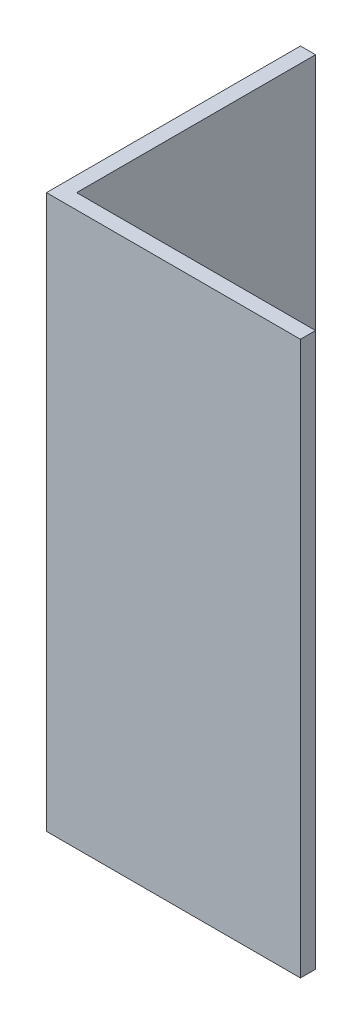
ISO-10303-21;
HEADER;
FILE_DESCRIPTION(('STEP AP214'),'2;1');
FILE_NAME('part.step','',(''),(''),'','','');
FILE_SCHEMA(('AUTOMOTIVE_DESIGN { 1 0 10303 214 1 1 1 1 }'));
ENDSEC;
DATA;
#1=APPLICATION_CONTEXT('core data for automotive mechanical design processes');
#2=APPLICATION_PROTOCOL_DEFINITION('international standard','automotive_design',2000,#1);
#3=PRODUCT_CONTEXT('',#1,'mechanical');
#4=PRODUCT('Part','Part','',(#3));
#5=PRODUCT_RELATED_PRODUCT_CATEGORY('part','',(#4));
#6=PRODUCT_DEFINITION_FORMATION('','',#4);
#7=PRODUCT_DEFINITION_CONTEXT('part definition',#1,'design');
#8=PRODUCT_DEFINITION('design','',#6,#7);
#9=PRODUCT_DEFINITION_SHAPE('','',#8);
#10=(LENGTH_UNIT() NAMED_UNIT(*) SI_UNIT(.MILLI.,.METRE.));
#11=(NAMED_UNIT(*) PLANE_ANGLE_UNIT() SI_UNIT($,.RADIAN.));
#12=(NAMED_UNIT(*) SI_UNIT($,.STERADIAN.) SOLID_ANGLE_UNIT());
#13=UNCERTAINTY_MEASURE_WITH_UNIT(LENGTH_MEASURE(1.E-05),#10,'distance_accuracy_value','');
#14=(GEOMETRIC_REPRESENTATION_CONTEXT(3) GLOBAL_UNCERTAINTY_ASSIGNED_CONTEXT((#13)) GLOBAL_UNIT_ASSIGNED_CONTEXT((#10,
#11,#12)) REPRESENTATION_CONTEXT('',''));
#15=CARTESIAN_POINT('',(0.,0.,0.));
#16=DIRECTION('',(0.,0.,1.));
#17=DIRECTION('',(1.,0.,0.));
#18=AXIS2_PLACEMENT_3D('',#15,#16,#17);
#19=CARTESIAN_POINT('',(-3.00000000000003,110.,-47.5));
#20=DIRECTION('',(0.,0.,1.));
#21=DIRECTION('',(1.,0.,0.));
#22=AXIS2_PLACEMENT_3D('',#19,#20,#21);
#23=PLANE('',#22);
#24=DIRECTION('',(-1.,0.,0.));
#25=VECTOR('',#24,1.);
#26=CARTESIAN_POINT('',(-3.00000000000003,0.,-47.5));
#27=LINE('',#26,#25);
#28=CARTESIAN_POINT('',(0.,0.,-47.5));
#29=VERTEX_POINT('',#28);
#30=CARTESIAN_POINT('',(-3.00000000000003,0.,-47.5));
#31=VERTEX_POINT('',#30);
#32=EDGE_CURVE('E141',#29,#31,#27,.T.);
#33=ORIENTED_EDGE('',*,*,#32,.T.);
#34=DIRECTION('',(0.,-1.,0.));
#35=VECTOR('',#34,1.);
#36=CARTESIAN_POINT('',(-3.00000000000003,110.,-47.5));
#37=LINE('',#36,#35);
#38=CARTESIAN_POINT('',(-3.00000000000003,110.,-47.5));
#39=VERTEX_POINT('',#38);
#40=EDGE_CURVE('E11',#39,#31,#37,.T.);
#41=ORIENTED_EDGE('',*,*,#40,.F.);
#42=DIRECTION('',(-1.,0.,0.));
#43=VECTOR('',#42,1.);
#44=CARTESIAN_POINT('',(-3.00000000000003,110.,-47.5));
#45=LINE('',#44,#43);
#46=CARTESIAN_POINT('',(0.,110.,-47.5));
#47=VERTEX_POINT('',#46);
#48=EDGE_CURVE('E156',#47,#39,#45,.T.);
#49=ORIENTED_EDGE('',*,*,#48,.F.);
#50=DIRECTION('',(0.,-1.,0.));
#51=VECTOR('',#50,1.);
#52=CARTESIAN_POINT('',(0.,110.,-47.5));
#53=LINE('',#52,#51);
#54=EDGE_CURVE('E137',#47,#29,#53,.T.);
#55=ORIENTED_EDGE('',*,*,#54,.T.);
#56=EDGE_LOOP('',(#33,#41,#49,#55));
#57=FACE_BOUND('',#56,.T.);
#58=ADVANCED_FACE('F41',(#57),#23,.F.);
#59=CARTESIAN_POINT('',(-3.00000000000001,110.,3.00000000000001));
#60=DIRECTION('',(1.,0.,0.));
#61=DIRECTION('',(0.,0.,-1.));
#62=AXIS2_PLACEMENT_3D('',#59,#60,#61);
#63=PLANE('',#62);
#64=DIRECTION('',(0.,0.,1.));
#65=VECTOR('',#64,1.);
#66=CARTESIAN_POINT('',(-3.00000000000001,0.,3.00000000000001));
#67=LINE('',#66,#65);
#68=CARTESIAN_POINT('',(-3.00000000000001,0.,3.00000000000001));
#69=VERTEX_POINT('',#68);
#70=EDGE_CURVE('E145',#31,#69,#67,.T.);
#71=ORIENTED_EDGE('',*,*,#70,.T.);
#72=DIRECTION('',(0.,-1.,0.));
#73=VECTOR('',#72,1.);
#74=CARTESIAN_POINT('',(-3.00000000000001,110.,3.00000000000001));
#75=LINE('',#74,#73);
#76=CARTESIAN_POINT('',(-3.00000000000001,110.,3.00000000000001));
#77=VERTEX_POINT('',#76);
#78=EDGE_CURVE('E50',#77,#69,#75,.T.);
#79=ORIENTED_EDGE('',*,*,#78,.F.);
#80=DIRECTION('',(0.,0.,1.));
#81=VECTOR('',#80,1.);
#82=CARTESIAN_POINT('',(-3.00000000000001,110.,3.00000000000001));
#83=LINE('',#82,#81);
#84=EDGE_CURVE('E103',#39,#77,#83,.T.);
#85=ORIENTED_EDGE('',*,*,#84,.F.);
#86=ORIENTED_EDGE('',*,*,#40,.T.);
#87=EDGE_LOOP('',(#71,#79,#85,#86));
#88=FACE_BOUND('',#87,.T.);
#89=ADVANCED_FACE('F184',(#88),#63,.F.);
#90=CARTESIAN_POINT('',(47.5,110.,3.));
#91=DIRECTION('',(0.,0.,-1.));
#92=DIRECTION('',(-1.,0.,0.));
#93=AXIS2_PLACEMENT_3D('',#90,#91,#92);
#94=PLANE('',#93);
#95=DIRECTION('',(1.,0.,0.));
#96=VECTOR('',#95,1.);
#97=CARTESIAN_POINT('',(47.5,0.,3.));
#98=LINE('',#97,#96);
#99=CARTESIAN_POINT('',(47.5,0.,3.));
#100=VERTEX_POINT('',#99);
#101=EDGE_CURVE('E148',#69,#100,#98,.T.);
#102=ORIENTED_EDGE('',*,*,#101,.T.);
#103=DIRECTION('',(0.,-1.,0.));
#104=VECTOR('',#103,1.);
#105=CARTESIAN_POINT('',(47.5,110.,3.));
#106=LINE('',#105,#104);
#107=CARTESIAN_POINT('',(47.5,110.,3.));
#108=VERTEX_POINT('',#107);
#109=EDGE_CURVE('E129',#108,#100,#106,.T.);
#110=ORIENTED_EDGE('',*,*,#109,.F.);
#111=DIRECTION('',(1.,0.,0.));
#112=VECTOR('',#111,1.);
#113=CARTESIAN_POINT('',(47.5,110.,3.));
#114=LINE('',#113,#112);
#115=EDGE_CURVE('E118',#77,#108,#114,.T.);
#116=ORIENTED_EDGE('',*,*,#115,.F.);
#117=ORIENTED_EDGE('',*,*,#78,.T.);
#118=EDGE_LOOP('',(#102,#110,#116,#117));
#119=FACE_BOUND('',#118,.T.);
#120=ADVANCED_FACE('F166',(#119),#94,.F.);
#121=CARTESIAN_POINT('',(47.5,110.,0.));
#122=DIRECTION('',(-1.,0.,0.));
#123=DIRECTION('',(0.,0.,1.));
#124=AXIS2_PLACEMENT_3D('',#121,#122,#123);
#125=PLANE('',#124);
#126=DIRECTION('',(0.,0.,-1.));
#127=VECTOR('',#126,1.);
#128=CARTESIAN_POINT('',(47.5,0.,0.));
#129=LINE('',#128,#127);
#130=CARTESIAN_POINT('',(47.5,0.,0.));
#131=VERTEX_POINT('',#130);
#132=EDGE_CURVE('E127',#100,#131,#129,.T.);
#133=ORIENTED_EDGE('',*,*,#132,.T.);
#134=DIRECTION('',(0.,-1.,0.));
#135=VECTOR('',#134,1.);
#136=CARTESIAN_POINT('',(47.5,110.,0.));
#137=LINE('',#136,#135);
#138=CARTESIAN_POINT('',(47.5,110.,0.));
#139=VERTEX_POINT('',#138);
#140=EDGE_CURVE('E124',#139,#131,#137,.T.);
#141=ORIENTED_EDGE('',*,*,#140,.F.);
#142=DIRECTION('',(0.,0.,-1.));
#143=VECTOR('',#142,1.);
#144=CARTESIAN_POINT('',(47.5,110.,0.));
#145=LINE('',#144,#143);
#146=EDGE_CURVE('E112',#108,#139,#145,.T.);
#147=ORIENTED_EDGE('',*,*,#146,.F.);
#148=ORIENTED_EDGE('',*,*,#109,.T.);
#149=EDGE_LOOP('',(#133,#141,#147,#148));
#150=FACE_BOUND('',#149,.T.);
#151=ADVANCED_FACE('F125',(#150),#125,.F.);
#152=CARTESIAN_POINT('',(0.,110.,0.));
#153=DIRECTION('',(0.,0.,1.));
#154=DIRECTION('',(1.,0.,0.));
#155=AXIS2_PLACEMENT_3D('',#152,#153,#154);
#156=PLANE('',#155);
#157=DIRECTION('',(-1.,0.,0.));
#158=VECTOR('',#157,1.);
#159=CARTESIAN_POINT('',(0.,0.,0.));
#160=LINE('',#159,#158);
#161=CARTESIAN_POINT('',(0.,0.,0.));
#162=VERTEX_POINT('',#161);
#163=EDGE_CURVE('E88',#131,#162,#160,.T.);
#164=ORIENTED_EDGE('',*,*,#163,.T.);
#165=DIRECTION('',(0.,-1.,0.));
#166=VECTOR('',#165,1.);
#167=CARTESIAN_POINT('',(0.,110.,0.));
#168=LINE('',#167,#166);
#169=CARTESIAN_POINT('',(0.,110.,0.));
#170=VERTEX_POINT('',#169);
#171=EDGE_CURVE('E130',#170,#162,#168,.T.);
#172=ORIENTED_EDGE('',*,*,#171,.F.);
#173=DIRECTION('',(-1.,0.,0.));
#174=VECTOR('',#173,1.);
#175=CARTESIAN_POINT('',(0.,110.,0.));
#176=LINE('',#175,#174);
#177=EDGE_CURVE('E116',#139,#170,#176,.T.);
#178=ORIENTED_EDGE('',*,*,#177,.F.);
#179=ORIENTED_EDGE('',*,*,#140,.T.);
#180=EDGE_LOOP('',(#164,#172,#178,#179));
#181=FACE_BOUND('',#180,.T.);
#182=ADVANCED_FACE('F132',(#181),#156,.F.);
#183=CARTESIAN_POINT('',(0.,110.,-47.5));
#184=DIRECTION('',(-1.,0.,0.));
#185=DIRECTION('',(0.,0.,1.));
#186=AXIS2_PLACEMENT_3D('',#183,#184,#185);
#187=PLANE('',#186);
#188=DIRECTION('',(0.,0.,-1.));
#189=VECTOR('',#188,1.);
#190=CARTESIAN_POINT('',(0.,0.,-47.5));
#191=LINE('',#190,#189);
#192=EDGE_CURVE('E95',#162,#29,#191,.T.);
#193=ORIENTED_EDGE('',*,*,#192,.T.);
#194=ORIENTED_EDGE('',*,*,#54,.F.);
#195=DIRECTION('',(0.,0.,-1.));
#196=VECTOR('',#195,1.);
#197=CARTESIAN_POINT('',(0.,110.,-47.5));
#198=LINE('',#197,#196);
#199=EDGE_CURVE('E61',#170,#47,#198,.T.);
#200=ORIENTED_EDGE('',*,*,#199,.F.);
#201=ORIENTED_EDGE('',*,*,#171,.T.);
#202=EDGE_LOOP('',(#193,#194,#200,#201));
#203=FACE_BOUND('',#202,.T.);
#204=ADVANCED_FACE('F173',(#203),#187,.F.);
#205=CARTESIAN_POINT('',(0.,110.,0.));
#206=DIRECTION('',(0.,-1.,0.));
#207=DIRECTION('',(0.,0.,-1.));
#208=AXIS2_PLACEMENT_3D('',#205,#206,#207);
#209=PLANE('',#208);
#210=ORIENTED_EDGE('',*,*,#48,.T.);
#211=ORIENTED_EDGE('',*,*,#84,.T.);
#212=ORIENTED_EDGE('',*,*,#115,.T.);
#213=ORIENTED_EDGE('',*,*,#146,.T.);
#214=ORIENTED_EDGE('',*,*,#177,.T.);
#215=ORIENTED_EDGE('',*,*,#199,.T.);
#216=EDGE_LOOP('',(#210,#211,#212,#213,#214,#215));
#217=FACE_BOUND('',#216,.T.);
#218=ADVANCED_FACE('F114',(#217),#209,.F.);
#219=CARTESIAN_POINT('',(0.,0.,0.));
#220=DIRECTION('',(0.,-1.,0.));
#221=DIRECTION('',(0.,0.,-1.));
#222=AXIS2_PLACEMENT_3D('',#219,#220,#221);
#223=PLANE('',#222);
#224=ORIENTED_EDGE('',*,*,#32,.F.);
#225=ORIENTED_EDGE('',*,*,#192,.F.);
#226=ORIENTED_EDGE('',*,*,#163,.F.);
#227=ORIENTED_EDGE('',*,*,#132,.F.);
#228=ORIENTED_EDGE('',*,*,#101,.F.);
#229=ORIENTED_EDGE('',*,*,#70,.F.);
#230=EDGE_LOOP('',(#224,#225,#226,#227,#228,#229));
#231=FACE_BOUND('',#230,.T.);
#232=ADVANCED_FACE('F169',(#231),#223,.T.);
#233=CLOSED_SHELL('',(#58,#89,#120,#151,#182,#204,#218,#232));
#234=MANIFOLD_SOLID_BREP('B2',#233);
#235=ADVANCED_BREP_SHAPE_REPRESENTATION('',(#18,#234),#14);
#236=SHAPE_DEFINITION_REPRESENTATION(#9,#235);
ENDSEC;
END-ISO-10303-21;
